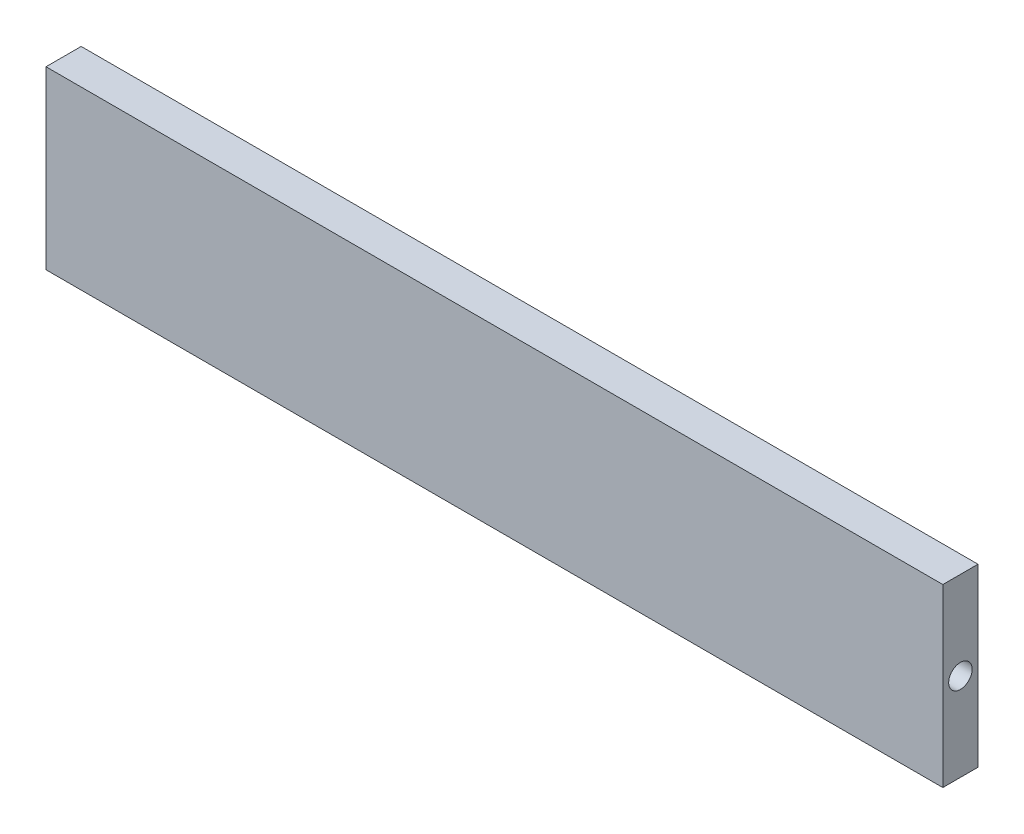
ISO-10303-21;
HEADER;
FILE_DESCRIPTION(('STEP AP214'),'2;1');
FILE_NAME('part.step','',(''),(''),'','','');
FILE_SCHEMA(('AUTOMOTIVE_DESIGN { 1 0 10303 214 1 1 1 1 }'));
ENDSEC;
DATA;
#1=APPLICATION_CONTEXT('core data for automotive mechanical design processes');
#2=APPLICATION_PROTOCOL_DEFINITION('international standard','automotive_design',2000,#1);
#3=PRODUCT_CONTEXT('',#1,'mechanical');
#4=PRODUCT('Part','Part','',(#3));
#5=PRODUCT_RELATED_PRODUCT_CATEGORY('part','',(#4));
#6=PRODUCT_DEFINITION_FORMATION('','',#4);
#7=PRODUCT_DEFINITION_CONTEXT('part definition',#1,'design');
#8=PRODUCT_DEFINITION('design','',#6,#7);
#9=PRODUCT_DEFINITION_SHAPE('','',#8);
#10=(LENGTH_UNIT() NAMED_UNIT(*) SI_UNIT(.MILLI.,.METRE.));
#11=(NAMED_UNIT(*) PLANE_ANGLE_UNIT() SI_UNIT($,.RADIAN.));
#12=(NAMED_UNIT(*) SI_UNIT($,.STERADIAN.) SOLID_ANGLE_UNIT());
#13=UNCERTAINTY_MEASURE_WITH_UNIT(LENGTH_MEASURE(1.E-05),#10,'distance_accuracy_value','');
#14=(GEOMETRIC_REPRESENTATION_CONTEXT(3) GLOBAL_UNCERTAINTY_ASSIGNED_CONTEXT((#13)) GLOBAL_UNIT_ASSIGNED_CONTEXT((#10,
#11,#12)) REPRESENTATION_CONTEXT('',''));
#15=CARTESIAN_POINT('',(0.,0.,0.));
#16=DIRECTION('',(0.,0.,1.));
#17=DIRECTION('',(1.,0.,0.));
#18=AXIS2_PLACEMENT_3D('',#15,#16,#17);
#19=CARTESIAN_POINT('',(-38.25,7.49999999999999,3.));
#20=DIRECTION('',(1.,0.,0.));
#21=DIRECTION('',(0.,1.,0.));
#22=AXIS2_PLACEMENT_3D('',#19,#20,#21);
#23=PLANE('',#22);
#24=CARTESIAN_POINT('',(-38.25,0.,1.5));
#25=DIRECTION('',(1.,0.,0.));
#26=DIRECTION('',(0.,0.,-1.));
#27=AXIS2_PLACEMENT_3D('',#24,#25,#26);
#28=CIRCLE('',#27,1.);
#29=CARTESIAN_POINT('',(-38.25,0.,0.500000000000001));
#30=VERTEX_POINT('',#29);
#31=EDGE_CURVE('E101',#30,#30,#28,.T.);
#32=ORIENTED_EDGE('',*,*,#31,.T.);
#33=EDGE_LOOP('',(#32));
#34=FACE_BOUND('',#33,.T.);
#35=DIRECTION('',(0.,-1.,0.));
#36=VECTOR('',#35,1.);
#37=CARTESIAN_POINT('',(-38.25,7.49999999999999,0.));
#38=LINE('',#37,#36);
#39=CARTESIAN_POINT('',(-38.25,7.49999999999999,0.));
#40=VERTEX_POINT('',#39);
#41=CARTESIAN_POINT('',(-38.25,-7.50000000000001,0.));
#42=VERTEX_POINT('',#41);
#43=EDGE_CURVE('E98',#40,#42,#38,.T.);
#44=ORIENTED_EDGE('',*,*,#43,.T.);
#45=DIRECTION('',(0.,0.,-1.));
#46=VECTOR('',#45,1.);
#47=CARTESIAN_POINT('',(-38.25,-7.50000000000001,3.));
#48=LINE('',#47,#46);
#49=CARTESIAN_POINT('',(-38.25,-7.50000000000001,3.));
#50=VERTEX_POINT('',#49);
#51=EDGE_CURVE('E11',#50,#42,#48,.T.);
#52=ORIENTED_EDGE('',*,*,#51,.F.);
#53=DIRECTION('',(0.,-1.,0.));
#54=VECTOR('',#53,1.);
#55=CARTESIAN_POINT('',(-38.25,7.49999999999999,3.));
#56=LINE('',#55,#54);
#57=CARTESIAN_POINT('',(-38.25,7.49999999999999,3.));
#58=VERTEX_POINT('',#57);
#59=EDGE_CURVE('E86',#58,#50,#56,.T.);
#60=ORIENTED_EDGE('',*,*,#59,.F.);
#61=DIRECTION('',(0.,0.,-1.));
#62=VECTOR('',#61,1.);
#63=CARTESIAN_POINT('',(-38.25,7.49999999999999,3.));
#64=LINE('',#63,#62);
#65=EDGE_CURVE('E94',#58,#40,#64,.T.);
#66=ORIENTED_EDGE('',*,*,#65,.T.);
#67=EDGE_LOOP('',(#44,#52,#60,#66));
#68=FACE_BOUND('',#67,.T.);
#69=ADVANCED_FACE('F35',(#34,#68),#23,.F.);
#70=CARTESIAN_POINT('',(38.25,-7.5,3.));
#71=DIRECTION('',(0.,1.,0.));
#72=DIRECTION('',(-1.,0.,0.));
#73=AXIS2_PLACEMENT_3D('',#70,#71,#72);
#74=PLANE('',#73);
#75=DIRECTION('',(1.,0.,0.));
#76=VECTOR('',#75,1.);
#77=CARTESIAN_POINT('',(38.25,-7.5,0.));
#78=LINE('',#77,#76);
#79=CARTESIAN_POINT('',(38.25,-7.5,0.));
#80=VERTEX_POINT('',#79);
#81=EDGE_CURVE('E90',#42,#80,#78,.T.);
#82=ORIENTED_EDGE('',*,*,#81,.T.);
#83=DIRECTION('',(0.,0.,-1.));
#84=VECTOR('',#83,1.);
#85=CARTESIAN_POINT('',(38.25,-7.5,3.));
#86=LINE('',#85,#84);
#87=CARTESIAN_POINT('',(38.25,-7.5,3.));
#88=VERTEX_POINT('',#87);
#89=EDGE_CURVE('E43',#88,#80,#86,.T.);
#90=ORIENTED_EDGE('',*,*,#89,.F.);
#91=DIRECTION('',(1.,0.,0.));
#92=VECTOR('',#91,1.);
#93=CARTESIAN_POINT('',(38.25,-7.5,3.));
#94=LINE('',#93,#92);
#95=EDGE_CURVE('E81',#50,#88,#94,.T.);
#96=ORIENTED_EDGE('',*,*,#95,.F.);
#97=ORIENTED_EDGE('',*,*,#51,.T.);
#98=EDGE_LOOP('',(#82,#90,#96,#97));
#99=FACE_BOUND('',#98,.T.);
#100=ADVANCED_FACE('F89',(#99),#74,.F.);
#101=CARTESIAN_POINT('',(38.25,7.5,3.));
#102=DIRECTION('',(-1.,0.,0.));
#103=DIRECTION('',(0.,0.,1.));
#104=AXIS2_PLACEMENT_3D('',#101,#102,#103);
#105=PLANE('',#104);
#106=CARTESIAN_POINT('',(38.25,0.,1.5));
#107=DIRECTION('',(1.,0.,0.));
#108=DIRECTION('',(0.,0.,-1.));
#109=AXIS2_PLACEMENT_3D('',#106,#107,#108);
#110=CIRCLE('',#109,1.);
#111=CARTESIAN_POINT('',(38.25,0.,0.500000000000001));
#112=VERTEX_POINT('',#111);
#113=EDGE_CURVE('E112',#112,#112,#110,.T.);
#114=ORIENTED_EDGE('',*,*,#113,.F.);
#115=EDGE_LOOP('',(#114));
#116=FACE_BOUND('',#115,.T.);
#117=DIRECTION('',(0.,1.,0.));
#118=VECTOR('',#117,1.);
#119=CARTESIAN_POINT('',(38.25,7.5,0.));
#120=LINE('',#119,#118);
#121=CARTESIAN_POINT('',(38.25,7.5,0.));
#122=VERTEX_POINT('',#121);
#123=EDGE_CURVE('E68',#80,#122,#120,.T.);
#124=ORIENTED_EDGE('',*,*,#123,.T.);
#125=DIRECTION('',(0.,0.,-1.));
#126=VECTOR('',#125,1.);
#127=CARTESIAN_POINT('',(38.25,7.5,3.));
#128=LINE('',#127,#126);
#129=CARTESIAN_POINT('',(38.25,7.5,3.));
#130=VERTEX_POINT('',#129);
#131=EDGE_CURVE('E91',#130,#122,#128,.T.);
#132=ORIENTED_EDGE('',*,*,#131,.F.);
#133=DIRECTION('',(0.,1.,0.));
#134=VECTOR('',#133,1.);
#135=CARTESIAN_POINT('',(38.25,7.5,3.));
#136=LINE('',#135,#134);
#137=EDGE_CURVE('E84',#88,#130,#136,.T.);
#138=ORIENTED_EDGE('',*,*,#137,.F.);
#139=ORIENTED_EDGE('',*,*,#89,.T.);
#140=EDGE_LOOP('',(#124,#132,#138,#139));
#141=FACE_BOUND('',#140,.T.);
#142=ADVANCED_FACE('F92',(#116,#141),#105,.F.);
#143=CARTESIAN_POINT('',(38.25,7.5,3.));
#144=DIRECTION('',(0.,-1.,0.));
#145=DIRECTION('',(1.,0.,0.));
#146=AXIS2_PLACEMENT_3D('',#143,#144,#145);
#147=PLANE('',#146);
#148=DIRECTION('',(-1.,0.,0.));
#149=VECTOR('',#148,1.);
#150=CARTESIAN_POINT('',(38.25,7.5,0.));
#151=LINE('',#150,#149);
#152=EDGE_CURVE('E74',#122,#40,#151,.T.);
#153=ORIENTED_EDGE('',*,*,#152,.T.);
#154=ORIENTED_EDGE('',*,*,#65,.F.);
#155=DIRECTION('',(-1.,0.,0.));
#156=VECTOR('',#155,1.);
#157=CARTESIAN_POINT('',(38.25,7.5,3.));
#158=LINE('',#157,#156);
#159=EDGE_CURVE('E51',#130,#58,#158,.T.);
#160=ORIENTED_EDGE('',*,*,#159,.F.);
#161=ORIENTED_EDGE('',*,*,#131,.T.);
#162=EDGE_LOOP('',(#153,#154,#160,#161));
#163=FACE_BOUND('',#162,.T.);
#164=ADVANCED_FACE('F106',(#163),#147,.F.);
#165=CARTESIAN_POINT('',(0.,0.,3.));
#166=DIRECTION('',(0.,0.,-1.));
#167=DIRECTION('',(-1.,0.,0.));
#168=AXIS2_PLACEMENT_3D('',#165,#166,#167);
#169=PLANE('',#168);
#170=ORIENTED_EDGE('',*,*,#59,.T.);
#171=ORIENTED_EDGE('',*,*,#95,.T.);
#172=ORIENTED_EDGE('',*,*,#137,.T.);
#173=ORIENTED_EDGE('',*,*,#159,.T.);
#174=EDGE_LOOP('',(#170,#171,#172,#173));
#175=FACE_BOUND('',#174,.T.);
#176=ADVANCED_FACE('F82',(#175),#169,.F.);
#177=CARTESIAN_POINT('',(0.,0.,0.));
#178=DIRECTION('',(0.,0.,-1.));
#179=DIRECTION('',(-1.,0.,0.));
#180=AXIS2_PLACEMENT_3D('',#177,#178,#179);
#181=PLANE('',#180);
#182=ORIENTED_EDGE('',*,*,#43,.F.);
#183=ORIENTED_EDGE('',*,*,#152,.F.);
#184=ORIENTED_EDGE('',*,*,#123,.F.);
#185=ORIENTED_EDGE('',*,*,#81,.F.);
#186=EDGE_LOOP('',(#182,#183,#184,#185));
#187=FACE_BOUND('',#186,.T.);
#188=ADVANCED_FACE('F109',(#187),#181,.T.);
#189=CARTESIAN_POINT('',(-38.25,0.,1.5));
#190=DIRECTION('',(1.,0.,0.));
#191=DIRECTION('',(0.,0.,-1.));
#192=AXIS2_PLACEMENT_3D('',#189,#190,#191);
#193=CYLINDRICAL_SURFACE('',#192,1.);
#194=ORIENTED_EDGE('',*,*,#31,.F.);
#195=EDGE_LOOP('',(#194));
#196=FACE_BOUND('',#195,.T.);
#197=ORIENTED_EDGE('',*,*,#113,.T.);
#198=EDGE_LOOP('',(#197));
#199=FACE_BOUND('',#198,.T.);
#200=ADVANCED_FACE('F119',(#196,#199),#193,.F.);
#201=CLOSED_SHELL('',(#69,#100,#142,#164,#176,#188,#200));
#202=MANIFOLD_SOLID_BREP('B2',#201);
#203=ADVANCED_BREP_SHAPE_REPRESENTATION('',(#18,#202),#14);
#204=SHAPE_DEFINITION_REPRESENTATION(#9,#203);
ENDSEC;
END-ISO-10303-21;
